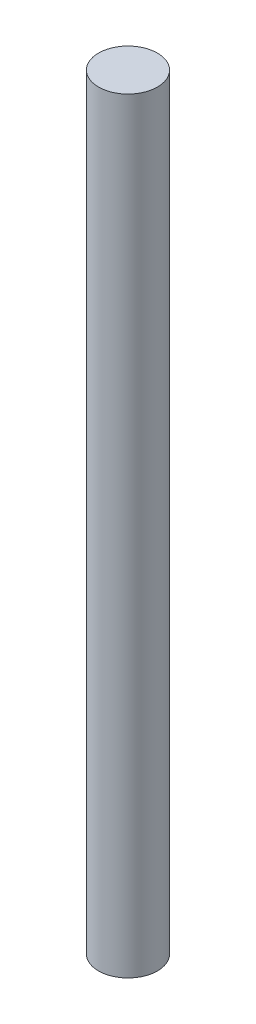
ISO-10303-21;
HEADER;
FILE_DESCRIPTION(('STEP AP214'),'2;1');
FILE_NAME('part.step','',(''),(''),'','','');
FILE_SCHEMA(('AUTOMOTIVE_DESIGN { 1 0 10303 214 1 1 1 1 }'));
ENDSEC;
DATA;
#1=APPLICATION_CONTEXT('core data for automotive mechanical design processes');
#2=APPLICATION_PROTOCOL_DEFINITION('international standard','automotive_design',2000,#1);
#3=PRODUCT_CONTEXT('',#1,'mechanical');
#4=PRODUCT('Part','Part','',(#3));
#5=PRODUCT_RELATED_PRODUCT_CATEGORY('part','',(#4));
#6=PRODUCT_DEFINITION_FORMATION('','',#4);
#7=PRODUCT_DEFINITION_CONTEXT('part definition',#1,'design');
#8=PRODUCT_DEFINITION('design','',#6,#7);
#9=PRODUCT_DEFINITION_SHAPE('','',#8);
#10=(LENGTH_UNIT() NAMED_UNIT(*) SI_UNIT(.MILLI.,.METRE.));
#11=(NAMED_UNIT(*) PLANE_ANGLE_UNIT() SI_UNIT($,.RADIAN.));
#12=(NAMED_UNIT(*) SI_UNIT($,.STERADIAN.) SOLID_ANGLE_UNIT());
#13=UNCERTAINTY_MEASURE_WITH_UNIT(LENGTH_MEASURE(1.E-05),#10,'distance_accuracy_value','');
#14=(GEOMETRIC_REPRESENTATION_CONTEXT(3) GLOBAL_UNCERTAINTY_ASSIGNED_CONTEXT((#13)) GLOBAL_UNIT_ASSIGNED_CONTEXT((#10,
#11,#12)) REPRESENTATION_CONTEXT('',''));
#15=CARTESIAN_POINT('',(0.,0.,0.));
#16=DIRECTION('',(0.,0.,1.));
#17=DIRECTION('',(1.,0.,0.));
#18=AXIS2_PLACEMENT_3D('',#15,#16,#17);
#19=CARTESIAN_POINT('',(0.,130.,0.));
#20=DIRECTION('',(0.,-1.,0.));
#21=DIRECTION('',(0.,0.,-1.));
#22=AXIS2_PLACEMENT_3D('',#19,#20,#21);
#23=CYLINDRICAL_SURFACE('',#22,5.);
#24=CARTESIAN_POINT('',(0.,130.,0.));
#25=DIRECTION('',(0.,1.,0.));
#26=DIRECTION('',(0.,0.,1.));
#27=AXIS2_PLACEMENT_3D('',#24,#25,#26);
#28=CIRCLE('',#27,5.);
#29=CARTESIAN_POINT('',(0.,130.,5.));
#30=VERTEX_POINT('',#29);
#31=EDGE_CURVE('E10',#30,#30,#28,.T.);
#32=ORIENTED_EDGE('',*,*,#31,.F.);
#33=EDGE_LOOP('',(#32));
#34=FACE_BOUND('',#33,.T.);
#35=CARTESIAN_POINT('',(0.,0.,0.));
#36=DIRECTION('',(0.,1.,0.));
#37=DIRECTION('',(0.,0.,1.));
#38=AXIS2_PLACEMENT_3D('',#35,#36,#37);
#39=CIRCLE('',#38,5.);
#40=CARTESIAN_POINT('',(0.,0.,5.));
#41=VERTEX_POINT('',#40);
#42=EDGE_CURVE('E40',#41,#41,#39,.T.);
#43=ORIENTED_EDGE('',*,*,#42,.T.);
#44=EDGE_LOOP('',(#43));
#45=FACE_BOUND('',#44,.T.);
#46=ADVANCED_FACE('F37',(#34,#45),#23,.T.);
#47=CARTESIAN_POINT('',(0.,130.,0.));
#48=DIRECTION('',(0.,1.,0.));
#49=DIRECTION('',(0.,0.,1.));
#50=AXIS2_PLACEMENT_3D('',#47,#48,#49);
#51=PLANE('',#50);
#52=ORIENTED_EDGE('',*,*,#31,.T.);
#53=EDGE_LOOP('',(#52));
#54=FACE_BOUND('',#53,.T.);
#55=ADVANCED_FACE('F54',(#54),#51,.T.);
#56=CARTESIAN_POINT('',(0.,0.,0.));
#57=DIRECTION('',(0.,1.,0.));
#58=DIRECTION('',(0.,0.,1.));
#59=AXIS2_PLACEMENT_3D('',#56,#57,#58);
#60=PLANE('',#59);
#61=ORIENTED_EDGE('',*,*,#42,.F.);
#62=EDGE_LOOP('',(#61));
#63=FACE_BOUND('',#62,.T.);
#64=ADVANCED_FACE('F52',(#63),#60,.F.);
#65=CLOSED_SHELL('',(#46,#55,#64));
#66=MANIFOLD_SOLID_BREP('B2',#65);
#67=ADVANCED_BREP_SHAPE_REPRESENTATION('',(#18,#66),#14);
#68=SHAPE_DEFINITION_REPRESENTATION(#9,#67);
ENDSEC;
END-ISO-10303-21;
